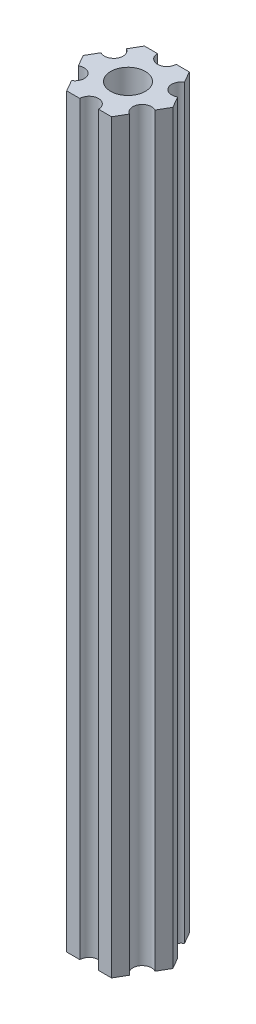
ISO-10303-21;
HEADER;
FILE_DESCRIPTION(('STEP AP214'),'2;1');
FILE_NAME('part.step','',(''),(''),'','','');
FILE_SCHEMA(('AUTOMOTIVE_DESIGN { 1 0 10303 214 1 1 1 1 }'));
ENDSEC;
DATA;
#1=APPLICATION_CONTEXT('core data for automotive mechanical design processes');
#2=APPLICATION_PROTOCOL_DEFINITION('international standard','automotive_design',2000,#1);
#3=PRODUCT_CONTEXT('',#1,'mechanical');
#4=PRODUCT('Part','Part','',(#3));
#5=PRODUCT_RELATED_PRODUCT_CATEGORY('part','',(#4));
#6=PRODUCT_DEFINITION_FORMATION('','',#4);
#7=PRODUCT_DEFINITION_CONTEXT('part definition',#1,'design');
#8=PRODUCT_DEFINITION('design','',#6,#7);
#9=PRODUCT_DEFINITION_SHAPE('','',#8);
#10=(LENGTH_UNIT() NAMED_UNIT(*) SI_UNIT(.MILLI.,.METRE.));
#11=(NAMED_UNIT(*) PLANE_ANGLE_UNIT() SI_UNIT($,.RADIAN.));
#12=(NAMED_UNIT(*) SI_UNIT($,.STERADIAN.) SOLID_ANGLE_UNIT());
#13=UNCERTAINTY_MEASURE_WITH_UNIT(LENGTH_MEASURE(1.E-05),#10,'distance_accuracy_value','');
#14=(GEOMETRIC_REPRESENTATION_CONTEXT(3) GLOBAL_UNCERTAINTY_ASSIGNED_CONTEXT((#13)) GLOBAL_UNIT_ASSIGNED_CONTEXT((#10,
#11,#12)) REPRESENTATION_CONTEXT('',''));
#15=CARTESIAN_POINT('',(0.,0.,0.));
#16=DIRECTION('',(0.,0.,1.));
#17=DIRECTION('',(1.,0.,0.));
#18=AXIS2_PLACEMENT_3D('',#15,#16,#17);
#19=CARTESIAN_POINT('',(5.41265877365274,-35.,3.125));
#20=DIRECTION('',(0.,1.,0.));
#21=DIRECTION('',(0.,0.,1.));
#22=AXIS2_PLACEMENT_3D('',#19,#20,#21);
#23=CYLINDRICAL_SURFACE('',#22,1.5);
#24=CARTESIAN_POINT('',(5.41265877365274,85.,3.125));
#25=DIRECTION('',(0.,-1.,0.));
#26=DIRECTION('',(0.,0.,-1.));
#27=AXIS2_PLACEMENT_3D('',#24,#25,#26);
#28=CIRCLE('',#27,1.5);
#29=CARTESIAN_POINT('',(4.66265877365274,85.,4.42403810567666));
#30=VERTEX_POINT('',#29);
#31=CARTESIAN_POINT('',(6.16265877365274,85.,1.82596189432335));
#32=VERTEX_POINT('',#31);
#33=EDGE_CURVE('E190',#30,#32,#28,.T.);
#34=ORIENTED_EDGE('',*,*,#33,.F.);
#35=DIRECTION('',(0.,1.,0.));
#36=VECTOR('',#35,1.);
#37=CARTESIAN_POINT('',(4.66265877365274,-35.,4.42403810567666));
#38=LINE('',#37,#36);
#39=CARTESIAN_POINT('',(4.66265877365274,-35.,4.42403810567666));
#40=VERTEX_POINT('',#39);
#41=EDGE_CURVE('E11',#40,#30,#38,.T.);
#42=ORIENTED_EDGE('',*,*,#41,.F.);
#43=CARTESIAN_POINT('',(5.41265877365274,-35.,3.125));
#44=DIRECTION('',(0.,-1.,0.));
#45=DIRECTION('',(0.,0.,-1.));
#46=AXIS2_PLACEMENT_3D('',#43,#44,#45);
#47=CIRCLE('',#46,1.5);
#48=CARTESIAN_POINT('',(6.16265877365274,-35.,1.82596189432335));
#49=VERTEX_POINT('',#48);
#50=EDGE_CURVE('E241',#40,#49,#47,.T.);
#51=ORIENTED_EDGE('',*,*,#50,.T.);
#52=DIRECTION('',(0.,1.,0.));
#53=VECTOR('',#52,1.);
#54=CARTESIAN_POINT('',(6.16265877365274,-35.,1.82596189432335));
#55=LINE('',#54,#53);
#56=EDGE_CURVE('E36',#49,#32,#55,.T.);
#57=ORIENTED_EDGE('',*,*,#56,.T.);
#58=EDGE_LOOP('',(#34,#42,#51,#57));
#59=FACE_BOUND('',#58,.T.);
#60=ADVANCED_FACE('F33',(#59),#23,.F.);
#61=CARTESIAN_POINT('',(3.60843918243516,-35.,6.25));
#62=DIRECTION('',(0.866025403784439,0.,0.5));
#63=DIRECTION('',(0.5,0.,-0.866025403784439));
#64=AXIS2_PLACEMENT_3D('',#61,#62,#63);
#65=PLANE('',#64);
#66=DIRECTION('',(0.5,0.,-0.866025403784439));
#67=VECTOR('',#66,1.);
#68=CARTESIAN_POINT('',(3.60843918243516,85.,6.25));
#69=LINE('',#68,#67);
#70=CARTESIAN_POINT('',(3.60843918243516,85.,6.25));
#71=VERTEX_POINT('',#70);
#72=EDGE_CURVE('E239',#71,#30,#69,.T.);
#73=ORIENTED_EDGE('',*,*,#72,.F.);
#74=DIRECTION('',(0.,1.,0.));
#75=VECTOR('',#74,1.);
#76=CARTESIAN_POINT('',(3.60843918243516,-35.,6.25));
#77=LINE('',#76,#75);
#78=CARTESIAN_POINT('',(3.60843918243516,-35.,6.25));
#79=VERTEX_POINT('',#78);
#80=EDGE_CURVE('E42',#79,#71,#77,.T.);
#81=ORIENTED_EDGE('',*,*,#80,.F.);
#82=DIRECTION('',(0.5,0.,-0.866025403784439));
#83=VECTOR('',#82,1.);
#84=CARTESIAN_POINT('',(3.60843918243516,-35.,6.25));
#85=LINE('',#84,#83);
#86=EDGE_CURVE('E180',#79,#40,#85,.T.);
#87=ORIENTED_EDGE('',*,*,#86,.T.);
#88=ORIENTED_EDGE('',*,*,#41,.T.);
#89=EDGE_LOOP('',(#73,#81,#87,#88));
#90=FACE_BOUND('',#89,.T.);
#91=ADVANCED_FACE('F273',(#90),#65,.T.);
#92=CARTESIAN_POINT('',(1.5,-35.,6.25));
#93=DIRECTION('',(0.,0.,1.));
#94=DIRECTION('',(1.,0.,0.));
#95=AXIS2_PLACEMENT_3D('',#92,#93,#94);
#96=PLANE('',#95);
#97=DIRECTION('',(1.,0.,0.));
#98=VECTOR('',#97,1.);
#99=CARTESIAN_POINT('',(1.5,85.,6.25));
#100=LINE('',#99,#98);
#101=CARTESIAN_POINT('',(1.5,85.,6.25));
#102=VERTEX_POINT('',#101);
#103=EDGE_CURVE('E167',#102,#71,#100,.T.);
#104=ORIENTED_EDGE('',*,*,#103,.F.);
#105=DIRECTION('',(0.,1.,0.));
#106=VECTOR('',#105,1.);
#107=CARTESIAN_POINT('',(1.5,-35.,6.25));
#108=LINE('',#107,#106);
#109=CARTESIAN_POINT('',(1.5,-35.,6.25));
#110=VERTEX_POINT('',#109);
#111=EDGE_CURVE('E162',#110,#102,#108,.T.);
#112=ORIENTED_EDGE('',*,*,#111,.F.);
#113=DIRECTION('',(1.,0.,0.));
#114=VECTOR('',#113,1.);
#115=CARTESIAN_POINT('',(1.5,-35.,6.25));
#116=LINE('',#115,#114);
#117=EDGE_CURVE('E165',#110,#79,#116,.T.);
#118=ORIENTED_EDGE('',*,*,#117,.T.);
#119=ORIENTED_EDGE('',*,*,#80,.T.);
#120=EDGE_LOOP('',(#104,#112,#118,#119));
#121=FACE_BOUND('',#120,.T.);
#122=ADVANCED_FACE('F164',(#121),#96,.T.);
#123=CARTESIAN_POINT('',(0.,-35.,6.25));
#124=DIRECTION('',(0.,1.,0.));
#125=DIRECTION('',(0.,0.,1.));
#126=AXIS2_PLACEMENT_3D('',#123,#124,#125);
#127=CYLINDRICAL_SURFACE('',#126,1.5);
#128=CARTESIAN_POINT('',(0.,85.,6.25));
#129=DIRECTION('',(0.,-1.,0.));
#130=DIRECTION('',(0.,0.,-1.));
#131=AXIS2_PLACEMENT_3D('',#128,#129,#130);
#132=CIRCLE('',#131,1.5);
#133=CARTESIAN_POINT('',(-1.5,85.,6.25));
#134=VERTEX_POINT('',#133);
#135=EDGE_CURVE('E236',#134,#102,#132,.T.);
#136=ORIENTED_EDGE('',*,*,#135,.F.);
#137=DIRECTION('',(0.,1.,0.));
#138=VECTOR('',#137,1.);
#139=CARTESIAN_POINT('',(-1.5,-35.,6.25));
#140=LINE('',#139,#138);
#141=CARTESIAN_POINT('',(-1.5,-35.,6.25));
#142=VERTEX_POINT('',#141);
#143=EDGE_CURVE('E172',#142,#134,#140,.T.);
#144=ORIENTED_EDGE('',*,*,#143,.F.);
#145=CARTESIAN_POINT('',(0.,-35.,6.25));
#146=DIRECTION('',(0.,-1.,0.));
#147=DIRECTION('',(0.,0.,-1.));
#148=AXIS2_PLACEMENT_3D('',#145,#146,#147);
#149=CIRCLE('',#148,1.5);
#150=EDGE_CURVE('E178',#142,#110,#149,.T.);
#151=ORIENTED_EDGE('',*,*,#150,.T.);
#152=ORIENTED_EDGE('',*,*,#111,.T.);
#153=EDGE_LOOP('',(#136,#144,#151,#152));
#154=FACE_BOUND('',#153,.T.);
#155=ADVANCED_FACE('F182',(#154),#127,.F.);
#156=CARTESIAN_POINT('',(-3.60843918243516,-35.,6.25));
#157=DIRECTION('',(0.,0.,1.));
#158=DIRECTION('',(1.,0.,0.));
#159=AXIS2_PLACEMENT_3D('',#156,#157,#158);
#160=PLANE('',#159);
#161=DIRECTION('',(1.,0.,0.));
#162=VECTOR('',#161,1.);
#163=CARTESIAN_POINT('',(-3.60843918243516,85.,6.25));
#164=LINE('',#163,#162);
#165=CARTESIAN_POINT('',(-3.60843918243516,85.,6.25));
#166=VERTEX_POINT('',#165);
#167=EDGE_CURVE('E233',#166,#134,#164,.T.);
#168=ORIENTED_EDGE('',*,*,#167,.F.);
#169=DIRECTION('',(0.,1.,0.));
#170=VECTOR('',#169,1.);
#171=CARTESIAN_POINT('',(-3.60843918243516,-35.,6.25));
#172=LINE('',#171,#170);
#173=CARTESIAN_POINT('',(-3.60843918243516,-35.,6.25));
#174=VERTEX_POINT('',#173);
#175=EDGE_CURVE('E245',#174,#166,#172,.T.);
#176=ORIENTED_EDGE('',*,*,#175,.F.);
#177=DIRECTION('',(1.,0.,0.));
#178=VECTOR('',#177,1.);
#179=CARTESIAN_POINT('',(-3.60843918243516,-35.,6.25));
#180=LINE('',#179,#178);
#181=EDGE_CURVE('E183',#174,#142,#180,.T.);
#182=ORIENTED_EDGE('',*,*,#181,.T.);
#183=ORIENTED_EDGE('',*,*,#143,.T.);
#184=EDGE_LOOP('',(#168,#176,#182,#183));
#185=FACE_BOUND('',#184,.T.);
#186=ADVANCED_FACE('F286',(#185),#160,.T.);
#187=CARTESIAN_POINT('',(-4.66265877365274,-35.,4.42403810567666));
#188=DIRECTION('',(-0.866025403784439,0.,0.5));
#189=DIRECTION('',(0.5,0.,0.866025403784439));
#190=AXIS2_PLACEMENT_3D('',#187,#188,#189);
#191=PLANE('',#190);
#192=DIRECTION('',(0.5,0.,0.866025403784439));
#193=VECTOR('',#192,1.);
#194=CARTESIAN_POINT('',(-4.66265877365274,85.,4.42403810567666));
#195=LINE('',#194,#193);
#196=CARTESIAN_POINT('',(-4.66265877365274,85.,4.42403810567666));
#197=VERTEX_POINT('',#196);
#198=EDGE_CURVE('E230',#197,#166,#195,.T.);
#199=ORIENTED_EDGE('',*,*,#198,.F.);
#200=DIRECTION('',(0.,1.,0.));
#201=VECTOR('',#200,1.);
#202=CARTESIAN_POINT('',(-4.66265877365274,-35.,4.42403810567666));
#203=LINE('',#202,#201);
#204=CARTESIAN_POINT('',(-4.66265877365274,-35.,4.42403810567666));
#205=VERTEX_POINT('',#204);
#206=EDGE_CURVE('E247',#205,#197,#203,.T.);
#207=ORIENTED_EDGE('',*,*,#206,.F.);
#208=DIRECTION('',(0.5,0.,0.866025403784439));
#209=VECTOR('',#208,1.);
#210=CARTESIAN_POINT('',(-4.66265877365274,-35.,4.42403810567666));
#211=LINE('',#210,#209);
#212=EDGE_CURVE('E185',#205,#174,#211,.T.);
#213=ORIENTED_EDGE('',*,*,#212,.T.);
#214=ORIENTED_EDGE('',*,*,#175,.T.);
#215=EDGE_LOOP('',(#199,#207,#213,#214));
#216=FACE_BOUND('',#215,.T.);
#217=ADVANCED_FACE('F289',(#216),#191,.T.);
#218=CARTESIAN_POINT('',(-5.41265877365274,-35.,3.125));
#219=DIRECTION('',(0.,1.,0.));
#220=DIRECTION('',(0.,0.,1.));
#221=AXIS2_PLACEMENT_3D('',#218,#219,#220);
#222=CYLINDRICAL_SURFACE('',#221,1.5);
#223=CARTESIAN_POINT('',(-5.41265877365274,85.,3.125));
#224=DIRECTION('',(0.,-1.,0.));
#225=DIRECTION('',(0.,0.,-1.));
#226=AXIS2_PLACEMENT_3D('',#223,#224,#225);
#227=CIRCLE('',#226,1.5);
#228=CARTESIAN_POINT('',(-6.16265877365274,85.,1.82596189432335));
#229=VERTEX_POINT('',#228);
#230=EDGE_CURVE('E227',#229,#197,#227,.T.);
#231=ORIENTED_EDGE('',*,*,#230,.F.);
#232=DIRECTION('',(0.,1.,0.));
#233=VECTOR('',#232,1.);
#234=CARTESIAN_POINT('',(-6.16265877365274,-35.,1.82596189432335));
#235=LINE('',#234,#233);
#236=CARTESIAN_POINT('',(-6.16265877365274,-35.,1.82596189432335));
#237=VERTEX_POINT('',#236);
#238=EDGE_CURVE('E249',#237,#229,#235,.T.);
#239=ORIENTED_EDGE('',*,*,#238,.F.);
#240=CARTESIAN_POINT('',(-5.41265877365274,-35.,3.125));
#241=DIRECTION('',(0.,-1.,0.));
#242=DIRECTION('',(0.,0.,-1.));
#243=AXIS2_PLACEMENT_3D('',#240,#241,#242);
#244=CIRCLE('',#243,1.5);
#245=EDGE_CURVE('E394',#237,#205,#244,.T.);
#246=ORIENTED_EDGE('',*,*,#245,.T.);
#247=ORIENTED_EDGE('',*,*,#206,.T.);
#248=EDGE_LOOP('',(#231,#239,#246,#247));
#249=FACE_BOUND('',#248,.T.);
#250=ADVANCED_FACE('F293',(#249),#222,.F.);
#251=CARTESIAN_POINT('',(-7.21687836487032,-35.,0.));
#252=DIRECTION('',(-0.86602540378444,0.,0.499999999999998));
#253=DIRECTION('',(0.499999999999998,0.,0.86602540378444));
#254=AXIS2_PLACEMENT_3D('',#251,#252,#253);
#255=PLANE('',#254);
#256=DIRECTION('',(0.499999999999998,0.,0.86602540378444));
#257=VECTOR('',#256,1.);
#258=CARTESIAN_POINT('',(-7.21687836487032,85.,0.));
#259=LINE('',#258,#257);
#260=CARTESIAN_POINT('',(-7.21687836487032,85.,0.));
#261=VERTEX_POINT('',#260);
#262=EDGE_CURVE('E224',#261,#229,#259,.T.);
#263=ORIENTED_EDGE('',*,*,#262,.F.);
#264=DIRECTION('',(0.,1.,0.));
#265=VECTOR('',#264,1.);
#266=CARTESIAN_POINT('',(-7.21687836487032,-35.,0.));
#267=LINE('',#266,#265);
#268=CARTESIAN_POINT('',(-7.21687836487032,-35.,0.));
#269=VERTEX_POINT('',#268);
#270=EDGE_CURVE('E251',#269,#261,#267,.T.);
#271=ORIENTED_EDGE('',*,*,#270,.F.);
#272=DIRECTION('',(0.499999999999998,0.,0.86602540378444));
#273=VECTOR('',#272,1.);
#274=CARTESIAN_POINT('',(-7.21687836487032,-35.,0.));
#275=LINE('',#274,#273);
#276=EDGE_CURVE('E391',#269,#237,#275,.T.);
#277=ORIENTED_EDGE('',*,*,#276,.T.);
#278=ORIENTED_EDGE('',*,*,#238,.T.);
#279=EDGE_LOOP('',(#263,#271,#277,#278));
#280=FACE_BOUND('',#279,.T.);
#281=ADVANCED_FACE('F297',(#280),#255,.T.);
#282=CARTESIAN_POINT('',(-6.16265877365274,-35.,-1.82596189432334));
#283=DIRECTION('',(-0.866025403784438,0.,-0.5));
#284=DIRECTION('',(-0.5,0.,0.866025403784438));
#285=AXIS2_PLACEMENT_3D('',#282,#283,#284);
#286=PLANE('',#285);
#287=DIRECTION('',(-0.5,0.,0.866025403784438));
#288=VECTOR('',#287,1.);
#289=CARTESIAN_POINT('',(-6.16265877365274,85.,-1.82596189432334));
#290=LINE('',#289,#288);
#291=CARTESIAN_POINT('',(-6.16265877365274,85.,-1.82596189432334));
#292=VERTEX_POINT('',#291);
#293=EDGE_CURVE('E221',#292,#261,#290,.T.);
#294=ORIENTED_EDGE('',*,*,#293,.F.);
#295=DIRECTION('',(0.,1.,0.));
#296=VECTOR('',#295,1.);
#297=CARTESIAN_POINT('',(-6.16265877365274,-35.,-1.82596189432334));
#298=LINE('',#297,#296);
#299=CARTESIAN_POINT('',(-6.16265877365274,-35.,-1.82596189432334));
#300=VERTEX_POINT('',#299);
#301=EDGE_CURVE('E253',#300,#292,#298,.T.);
#302=ORIENTED_EDGE('',*,*,#301,.F.);
#303=DIRECTION('',(-0.5,0.,0.866025403784438));
#304=VECTOR('',#303,1.);
#305=CARTESIAN_POINT('',(-6.16265877365274,-35.,-1.82596189432334));
#306=LINE('',#305,#304);
#307=EDGE_CURVE('E388',#300,#269,#306,.T.);
#308=ORIENTED_EDGE('',*,*,#307,.T.);
#309=ORIENTED_EDGE('',*,*,#270,.T.);
#310=EDGE_LOOP('',(#294,#302,#308,#309));
#311=FACE_BOUND('',#310,.T.);
#312=ADVANCED_FACE('F301',(#311),#286,.T.);
#313=CARTESIAN_POINT('',(-5.41265877365274,-35.,-3.125));
#314=DIRECTION('',(0.,1.,0.));
#315=DIRECTION('',(0.,0.,1.));
#316=AXIS2_PLACEMENT_3D('',#313,#314,#315);
#317=CYLINDRICAL_SURFACE('',#316,1.5);
#318=CARTESIAN_POINT('',(-5.41265877365274,85.,-3.125));
#319=DIRECTION('',(0.,-1.,0.));
#320=DIRECTION('',(0.,0.,-1.));
#321=AXIS2_PLACEMENT_3D('',#318,#319,#320);
#322=CIRCLE('',#321,1.5);
#323=CARTESIAN_POINT('',(-4.66265877365274,85.,-4.42403810567666));
#324=VERTEX_POINT('',#323);
#325=EDGE_CURVE('E218',#324,#292,#322,.T.);
#326=ORIENTED_EDGE('',*,*,#325,.F.);
#327=DIRECTION('',(0.,1.,0.));
#328=VECTOR('',#327,1.);
#329=CARTESIAN_POINT('',(-4.66265877365274,-35.,-4.42403810567666));
#330=LINE('',#329,#328);
#331=CARTESIAN_POINT('',(-4.66265877365274,-35.,-4.42403810567666));
#332=VERTEX_POINT('',#331);
#333=EDGE_CURVE('E255',#332,#324,#330,.T.);
#334=ORIENTED_EDGE('',*,*,#333,.F.);
#335=CARTESIAN_POINT('',(-5.41265877365274,-35.,-3.125));
#336=DIRECTION('',(0.,-1.,0.));
#337=DIRECTION('',(0.,0.,-1.));
#338=AXIS2_PLACEMENT_3D('',#335,#336,#337);
#339=CIRCLE('',#338,1.5);
#340=EDGE_CURVE('E385',#332,#300,#339,.T.);
#341=ORIENTED_EDGE('',*,*,#340,.T.);
#342=ORIENTED_EDGE('',*,*,#301,.T.);
#343=EDGE_LOOP('',(#326,#334,#341,#342));
#344=FACE_BOUND('',#343,.T.);
#345=ADVANCED_FACE('F305',(#344),#317,.F.);
#346=CARTESIAN_POINT('',(-3.60843918243516,-35.,-6.25));
#347=DIRECTION('',(-0.866025403784439,0.,-0.5));
#348=DIRECTION('',(-0.5,0.,0.866025403784439));
#349=AXIS2_PLACEMENT_3D('',#346,#347,#348);
#350=PLANE('',#349);
#351=DIRECTION('',(-0.5,0.,0.866025403784439));
#352=VECTOR('',#351,1.);
#353=CARTESIAN_POINT('',(-3.60843918243516,85.,-6.25));
#354=LINE('',#353,#352);
#355=CARTESIAN_POINT('',(-3.60843918243516,85.,-6.25));
#356=VERTEX_POINT('',#355);
#357=EDGE_CURVE('E215',#356,#324,#354,.T.);
#358=ORIENTED_EDGE('',*,*,#357,.F.);
#359=DIRECTION('',(0.,1.,0.));
#360=VECTOR('',#359,1.);
#361=CARTESIAN_POINT('',(-3.60843918243516,-35.,-6.25));
#362=LINE('',#361,#360);
#363=CARTESIAN_POINT('',(-3.60843918243516,-35.,-6.25));
#364=VERTEX_POINT('',#363);
#365=EDGE_CURVE('E257',#364,#356,#362,.T.);
#366=ORIENTED_EDGE('',*,*,#365,.F.);
#367=DIRECTION('',(-0.5,0.,0.866025403784439));
#368=VECTOR('',#367,1.);
#369=CARTESIAN_POINT('',(-3.60843918243516,-35.,-6.25));
#370=LINE('',#369,#368);
#371=EDGE_CURVE('E382',#364,#332,#370,.T.);
#372=ORIENTED_EDGE('',*,*,#371,.T.);
#373=ORIENTED_EDGE('',*,*,#333,.T.);
#374=EDGE_LOOP('',(#358,#366,#372,#373));
#375=FACE_BOUND('',#374,.T.);
#376=ADVANCED_FACE('F309',(#375),#350,.T.);
#377=CARTESIAN_POINT('',(-1.5,-35.,-6.25));
#378=DIRECTION('',(0.,0.,-1.));
#379=DIRECTION('',(-1.,0.,0.));
#380=AXIS2_PLACEMENT_3D('',#377,#378,#379);
#381=PLANE('',#380);
#382=DIRECTION('',(-1.,0.,0.));
#383=VECTOR('',#382,1.);
#384=CARTESIAN_POINT('',(-1.5,85.,-6.25));
#385=LINE('',#384,#383);
#386=CARTESIAN_POINT('',(-1.5,85.,-6.25));
#387=VERTEX_POINT('',#386);
#388=EDGE_CURVE('E212',#387,#356,#385,.T.);
#389=ORIENTED_EDGE('',*,*,#388,.F.);
#390=DIRECTION('',(0.,1.,0.));
#391=VECTOR('',#390,1.);
#392=CARTESIAN_POINT('',(-1.5,-35.,-6.25));
#393=LINE('',#392,#391);
#394=CARTESIAN_POINT('',(-1.5,-35.,-6.25));
#395=VERTEX_POINT('',#394);
#396=EDGE_CURVE('E259',#395,#387,#393,.T.);
#397=ORIENTED_EDGE('',*,*,#396,.F.);
#398=DIRECTION('',(-1.,0.,0.));
#399=VECTOR('',#398,1.);
#400=CARTESIAN_POINT('',(-1.5,-35.,-6.25));
#401=LINE('',#400,#399);
#402=EDGE_CURVE('E379',#395,#364,#401,.T.);
#403=ORIENTED_EDGE('',*,*,#402,.T.);
#404=ORIENTED_EDGE('',*,*,#365,.T.);
#405=EDGE_LOOP('',(#389,#397,#403,#404));
#406=FACE_BOUND('',#405,.T.);
#407=ADVANCED_FACE('F313',(#406),#381,.T.);
#408=CARTESIAN_POINT('',(0.,-35.,-6.25));
#409=DIRECTION('',(0.,1.,0.));
#410=DIRECTION('',(0.,0.,1.));
#411=AXIS2_PLACEMENT_3D('',#408,#409,#410);
#412=CYLINDRICAL_SURFACE('',#411,1.5);
#413=CARTESIAN_POINT('',(0.,85.,-6.25));
#414=DIRECTION('',(0.,-1.,0.));
#415=DIRECTION('',(0.,0.,-1.));
#416=AXIS2_PLACEMENT_3D('',#413,#414,#415);
#417=CIRCLE('',#416,1.5);
#418=CARTESIAN_POINT('',(1.5,85.,-6.25));
#419=VERTEX_POINT('',#418);
#420=EDGE_CURVE('E209',#419,#387,#417,.T.);
#421=ORIENTED_EDGE('',*,*,#420,.F.);
#422=DIRECTION('',(0.,1.,0.));
#423=VECTOR('',#422,1.);
#424=CARTESIAN_POINT('',(1.5,-35.,-6.25));
#425=LINE('',#424,#423);
#426=CARTESIAN_POINT('',(1.5,-35.,-6.25));
#427=VERTEX_POINT('',#426);
#428=EDGE_CURVE('E261',#427,#419,#425,.T.);
#429=ORIENTED_EDGE('',*,*,#428,.F.);
#430=CARTESIAN_POINT('',(0.,-35.,-6.25));
#431=DIRECTION('',(0.,-1.,0.));
#432=DIRECTION('',(0.,0.,-1.));
#433=AXIS2_PLACEMENT_3D('',#430,#431,#432);
#434=CIRCLE('',#433,1.5);
#435=EDGE_CURVE('E376',#427,#395,#434,.T.);
#436=ORIENTED_EDGE('',*,*,#435,.T.);
#437=ORIENTED_EDGE('',*,*,#396,.T.);
#438=EDGE_LOOP('',(#421,#429,#436,#437));
#439=FACE_BOUND('',#438,.T.);
#440=ADVANCED_FACE('F317',(#439),#412,.F.);
#441=CARTESIAN_POINT('',(3.60843918243516,-35.,-6.25));
#442=DIRECTION('',(0.,0.,-1.));
#443=DIRECTION('',(-1.,0.,0.));
#444=AXIS2_PLACEMENT_3D('',#441,#442,#443);
#445=PLANE('',#444);
#446=DIRECTION('',(-1.,0.,0.));
#447=VECTOR('',#446,1.);
#448=CARTESIAN_POINT('',(3.60843918243516,85.,-6.25));
#449=LINE('',#448,#447);
#450=CARTESIAN_POINT('',(3.60843918243516,85.,-6.25));
#451=VERTEX_POINT('',#450);
#452=EDGE_CURVE('E206',#451,#419,#449,.T.);
#453=ORIENTED_EDGE('',*,*,#452,.F.);
#454=DIRECTION('',(0.,1.,0.));
#455=VECTOR('',#454,1.);
#456=CARTESIAN_POINT('',(3.60843918243516,-35.,-6.25));
#457=LINE('',#456,#455);
#458=CARTESIAN_POINT('',(3.60843918243516,-35.,-6.25));
#459=VERTEX_POINT('',#458);
#460=EDGE_CURVE('E263',#459,#451,#457,.T.);
#461=ORIENTED_EDGE('',*,*,#460,.F.);
#462=DIRECTION('',(-1.,0.,0.));
#463=VECTOR('',#462,1.);
#464=CARTESIAN_POINT('',(3.60843918243516,-35.,-6.25));
#465=LINE('',#464,#463);
#466=EDGE_CURVE('E373',#459,#427,#465,.T.);
#467=ORIENTED_EDGE('',*,*,#466,.T.);
#468=ORIENTED_EDGE('',*,*,#428,.T.);
#469=EDGE_LOOP('',(#453,#461,#467,#468));
#470=FACE_BOUND('',#469,.T.);
#471=ADVANCED_FACE('F321',(#470),#445,.T.);
#472=CARTESIAN_POINT('',(4.66265877365274,-35.,-4.42403810567666));
#473=DIRECTION('',(0.866025403784439,0.,-0.5));
#474=DIRECTION('',(-0.5,0.,-0.866025403784439));
#475=AXIS2_PLACEMENT_3D('',#472,#473,#474);
#476=PLANE('',#475);
#477=DIRECTION('',(-0.5,0.,-0.866025403784439));
#478=VECTOR('',#477,1.);
#479=CARTESIAN_POINT('',(4.66265877365274,85.,-4.42403810567666));
#480=LINE('',#479,#478);
#481=CARTESIAN_POINT('',(4.66265877365274,85.,-4.42403810567666));
#482=VERTEX_POINT('',#481);
#483=EDGE_CURVE('E203',#482,#451,#480,.T.);
#484=ORIENTED_EDGE('',*,*,#483,.F.);
#485=DIRECTION('',(0.,1.,0.));
#486=VECTOR('',#485,1.);
#487=CARTESIAN_POINT('',(4.66265877365274,-35.,-4.42403810567666));
#488=LINE('',#487,#486);
#489=CARTESIAN_POINT('',(4.66265877365274,-35.,-4.42403810567666));
#490=VERTEX_POINT('',#489);
#491=EDGE_CURVE('E265',#490,#482,#488,.T.);
#492=ORIENTED_EDGE('',*,*,#491,.F.);
#493=DIRECTION('',(-0.5,0.,-0.866025403784439));
#494=VECTOR('',#493,1.);
#495=CARTESIAN_POINT('',(4.66265877365274,-35.,-4.42403810567666));
#496=LINE('',#495,#494);
#497=EDGE_CURVE('E370',#490,#459,#496,.T.);
#498=ORIENTED_EDGE('',*,*,#497,.T.);
#499=ORIENTED_EDGE('',*,*,#460,.T.);
#500=EDGE_LOOP('',(#484,#492,#498,#499));
#501=FACE_BOUND('',#500,.T.);
#502=ADVANCED_FACE('F325',(#501),#476,.T.);
#503=CARTESIAN_POINT('',(5.41265877365274,-35.,-3.125));
#504=DIRECTION('',(0.,1.,0.));
#505=DIRECTION('',(0.,0.,1.));
#506=AXIS2_PLACEMENT_3D('',#503,#504,#505);
#507=CYLINDRICAL_SURFACE('',#506,1.5);
#508=CARTESIAN_POINT('',(5.41265877365274,85.,-3.125));
#509=DIRECTION('',(0.,-1.,0.));
#510=DIRECTION('',(0.,0.,-1.));
#511=AXIS2_PLACEMENT_3D('',#508,#509,#510);
#512=CIRCLE('',#511,1.5);
#513=CARTESIAN_POINT('',(6.16265877365274,85.,-1.82596189432334));
#514=VERTEX_POINT('',#513);
#515=EDGE_CURVE('E200',#514,#482,#512,.T.);
#516=ORIENTED_EDGE('',*,*,#515,.F.);
#517=DIRECTION('',(0.,1.,0.));
#518=VECTOR('',#517,1.);
#519=CARTESIAN_POINT('',(6.16265877365274,-35.,-1.82596189432334));
#520=LINE('',#519,#518);
#521=CARTESIAN_POINT('',(6.16265877365274,-35.,-1.82596189432334));
#522=VERTEX_POINT('',#521);
#523=EDGE_CURVE('E267',#522,#514,#520,.T.);
#524=ORIENTED_EDGE('',*,*,#523,.F.);
#525=CARTESIAN_POINT('',(5.41265877365274,-35.,-3.125));
#526=DIRECTION('',(0.,-1.,0.));
#527=DIRECTION('',(0.,0.,-1.));
#528=AXIS2_PLACEMENT_3D('',#525,#526,#527);
#529=CIRCLE('',#528,1.5);
#530=EDGE_CURVE('E367',#522,#490,#529,.T.);
#531=ORIENTED_EDGE('',*,*,#530,.T.);
#532=ORIENTED_EDGE('',*,*,#491,.T.);
#533=EDGE_LOOP('',(#516,#524,#531,#532));
#534=FACE_BOUND('',#533,.T.);
#535=ADVANCED_FACE('F329',(#534),#507,.F.);
#536=CARTESIAN_POINT('',(7.21687836487032,-35.,0.));
#537=DIRECTION('',(0.866025403784439,0.,-0.5));
#538=DIRECTION('',(-0.5,0.,-0.866025403784439));
#539=AXIS2_PLACEMENT_3D('',#536,#537,#538);
#540=PLANE('',#539);
#541=DIRECTION('',(-0.5,0.,-0.866025403784439));
#542=VECTOR('',#541,1.);
#543=CARTESIAN_POINT('',(7.21687836487032,85.,0.));
#544=LINE('',#543,#542);
#545=CARTESIAN_POINT('',(7.21687836487032,85.,0.));
#546=VERTEX_POINT('',#545);
#547=EDGE_CURVE('E197',#546,#514,#544,.T.);
#548=ORIENTED_EDGE('',*,*,#547,.F.);
#549=DIRECTION('',(0.,1.,0.));
#550=VECTOR('',#549,1.);
#551=CARTESIAN_POINT('',(7.21687836487032,-35.,0.));
#552=LINE('',#551,#550);
#553=CARTESIAN_POINT('',(7.21687836487032,-35.,0.));
#554=VERTEX_POINT('',#553);
#555=EDGE_CURVE('E268',#554,#546,#552,.T.);
#556=ORIENTED_EDGE('',*,*,#555,.F.);
#557=DIRECTION('',(-0.5,0.,-0.866025403784439));
#558=VECTOR('',#557,1.);
#559=CARTESIAN_POINT('',(7.21687836487032,-35.,0.));
#560=LINE('',#559,#558);
#561=EDGE_CURVE('E364',#554,#522,#560,.T.);
#562=ORIENTED_EDGE('',*,*,#561,.T.);
#563=ORIENTED_EDGE('',*,*,#523,.T.);
#564=EDGE_LOOP('',(#548,#556,#562,#563));
#565=FACE_BOUND('',#564,.T.);
#566=ADVANCED_FACE('F333',(#565),#540,.T.);
#567=CARTESIAN_POINT('',(6.16265877365274,-35.,1.82596189432335));
#568=DIRECTION('',(0.866025403784439,0.,0.499999999999999));
#569=DIRECTION('',(0.499999999999999,0.,-0.866025403784439));
#570=AXIS2_PLACEMENT_3D('',#567,#568,#569);
#571=PLANE('',#570);
#572=DIRECTION('',(0.499999999999999,0.,-0.86602540378444));
#573=VECTOR('',#572,1.);
#574=CARTESIAN_POINT('',(6.16265877365274,85.,1.82596189432335));
#575=LINE('',#574,#573);
#576=EDGE_CURVE('E193',#32,#546,#575,.T.);
#577=ORIENTED_EDGE('',*,*,#576,.F.);
#578=ORIENTED_EDGE('',*,*,#56,.F.);
#579=DIRECTION('',(0.499999999999999,0.,-0.86602540378444));
#580=VECTOR('',#579,1.);
#581=CARTESIAN_POINT('',(6.16265877365274,-35.,1.82596189432335));
#582=LINE('',#581,#580);
#583=EDGE_CURVE('E362',#49,#554,#582,.T.);
#584=ORIENTED_EDGE('',*,*,#583,.T.);
#585=ORIENTED_EDGE('',*,*,#555,.T.);
#586=EDGE_LOOP('',(#577,#578,#584,#585));
#587=FACE_BOUND('',#586,.T.);
#588=ADVANCED_FACE('F270',(#587),#571,.T.);
#589=CARTESIAN_POINT('',(5.41265877365274,-35.,3.125));
#590=DIRECTION('',(0.,-1.,0.));
#591=DIRECTION('',(0.,0.,-1.));
#592=AXIS2_PLACEMENT_3D('',#589,#590,#591);
#593=PLANE('',#592);
#594=CARTESIAN_POINT('',(0.,-35.,0.));
#595=DIRECTION('',(0.,1.,0.));
#596=DIRECTION('',(0.,0.,-1.));
#597=AXIS2_PLACEMENT_3D('',#594,#595,#596);
#598=CIRCLE('',#597,2.79);
#599=CARTESIAN_POINT('',(0.,-35.,-2.79));
#600=VERTEX_POINT('',#599);
#601=EDGE_CURVE('E194',#600,#600,#598,.T.);
#602=ORIENTED_EDGE('',*,*,#601,.T.);
#603=EDGE_LOOP('',(#602));
#604=FACE_BOUND('',#603,.T.);
#605=ORIENTED_EDGE('',*,*,#50,.F.);
#606=ORIENTED_EDGE('',*,*,#86,.F.);
#607=ORIENTED_EDGE('',*,*,#117,.F.);
#608=ORIENTED_EDGE('',*,*,#150,.F.);
#609=ORIENTED_EDGE('',*,*,#181,.F.);
#610=ORIENTED_EDGE('',*,*,#212,.F.);
#611=ORIENTED_EDGE('',*,*,#245,.F.);
#612=ORIENTED_EDGE('',*,*,#276,.F.);
#613=ORIENTED_EDGE('',*,*,#307,.F.);
#614=ORIENTED_EDGE('',*,*,#340,.F.);
#615=ORIENTED_EDGE('',*,*,#371,.F.);
#616=ORIENTED_EDGE('',*,*,#402,.F.);
#617=ORIENTED_EDGE('',*,*,#435,.F.);
#618=ORIENTED_EDGE('',*,*,#466,.F.);
#619=ORIENTED_EDGE('',*,*,#497,.F.);
#620=ORIENTED_EDGE('',*,*,#530,.F.);
#621=ORIENTED_EDGE('',*,*,#561,.F.);
#622=ORIENTED_EDGE('',*,*,#583,.F.);
#623=EDGE_LOOP('',(#605,#606,#607,#608,#609,#610,#611,#612,#613,#614,#615,#616,#617,#618,#619,
#620,#621,#622));
#624=FACE_BOUND('',#623,.T.);
#625=ADVANCED_FACE('F176',(#604,#624),#593,.T.);
#626=CARTESIAN_POINT('',(5.41265877365274,85.,3.125));
#627=DIRECTION('',(0.,-1.,0.));
#628=DIRECTION('',(0.,0.,-1.));
#629=AXIS2_PLACEMENT_3D('',#626,#627,#628);
#630=PLANE('',#629);
#631=CARTESIAN_POINT('',(0.,85.,0.));
#632=DIRECTION('',(0.,1.,0.));
#633=DIRECTION('',(0.,0.,-1.));
#634=AXIS2_PLACEMENT_3D('',#631,#632,#633);
#635=CIRCLE('',#634,2.79);
#636=CARTESIAN_POINT('',(0.,85.,-2.79));
#637=VERTEX_POINT('',#636);
#638=EDGE_CURVE('E357',#637,#637,#635,.T.);
#639=ORIENTED_EDGE('',*,*,#638,.F.);
#640=EDGE_LOOP('',(#639));
#641=FACE_BOUND('',#640,.T.);
#642=ORIENTED_EDGE('',*,*,#33,.T.);
#643=ORIENTED_EDGE('',*,*,#576,.T.);
#644=ORIENTED_EDGE('',*,*,#547,.T.);
#645=ORIENTED_EDGE('',*,*,#515,.T.);
#646=ORIENTED_EDGE('',*,*,#483,.T.);
#647=ORIENTED_EDGE('',*,*,#452,.T.);
#648=ORIENTED_EDGE('',*,*,#420,.T.);
#649=ORIENTED_EDGE('',*,*,#388,.T.);
#650=ORIENTED_EDGE('',*,*,#357,.T.);
#651=ORIENTED_EDGE('',*,*,#325,.T.);
#652=ORIENTED_EDGE('',*,*,#293,.T.);
#653=ORIENTED_EDGE('',*,*,#262,.T.);
#654=ORIENTED_EDGE('',*,*,#230,.T.);
#655=ORIENTED_EDGE('',*,*,#198,.T.);
#656=ORIENTED_EDGE('',*,*,#167,.T.);
#657=ORIENTED_EDGE('',*,*,#135,.T.);
#658=ORIENTED_EDGE('',*,*,#103,.T.);
#659=ORIENTED_EDGE('',*,*,#72,.T.);
#660=EDGE_LOOP('',(#642,#643,#644,#645,#646,#647,#648,#649,#650,#651,#652,#653,#654,#655,#656,
#657,#658,#659));
#661=FACE_BOUND('',#660,.T.);
#662=ADVANCED_FACE('F272',(#641,#661),#630,.F.);
#663=CARTESIAN_POINT('',(0.,-35.,0.));
#664=DIRECTION('',(0.,1.,0.));
#665=DIRECTION('',(0.,0.,1.));
#666=AXIS2_PLACEMENT_3D('',#663,#664,#665);
#667=CYLINDRICAL_SURFACE('',#666,2.79);
#668=ORIENTED_EDGE('',*,*,#601,.F.);
#669=EDGE_LOOP('',(#668));
#670=FACE_BOUND('',#669,.T.);
#671=ORIENTED_EDGE('',*,*,#638,.T.);
#672=EDGE_LOOP('',(#671));
#673=FACE_BOUND('',#672,.T.);
#674=ADVANCED_FACE('F345',(#670,#673),#667,.F.);
#675=CLOSED_SHELL('',(#60,#91,#122,#155,#186,#217,#250,#281,#312,#345,#376,#407,#440,#471,#502,
#535,#566,#588,#625,#662,#674));
#676=MANIFOLD_SOLID_BREP('B2',#675);
#677=ADVANCED_BREP_SHAPE_REPRESENTATION('',(#18,#676),#14);
#678=SHAPE_DEFINITION_REPRESENTATION(#9,#677);
ENDSEC;
END-ISO-10303-21;
